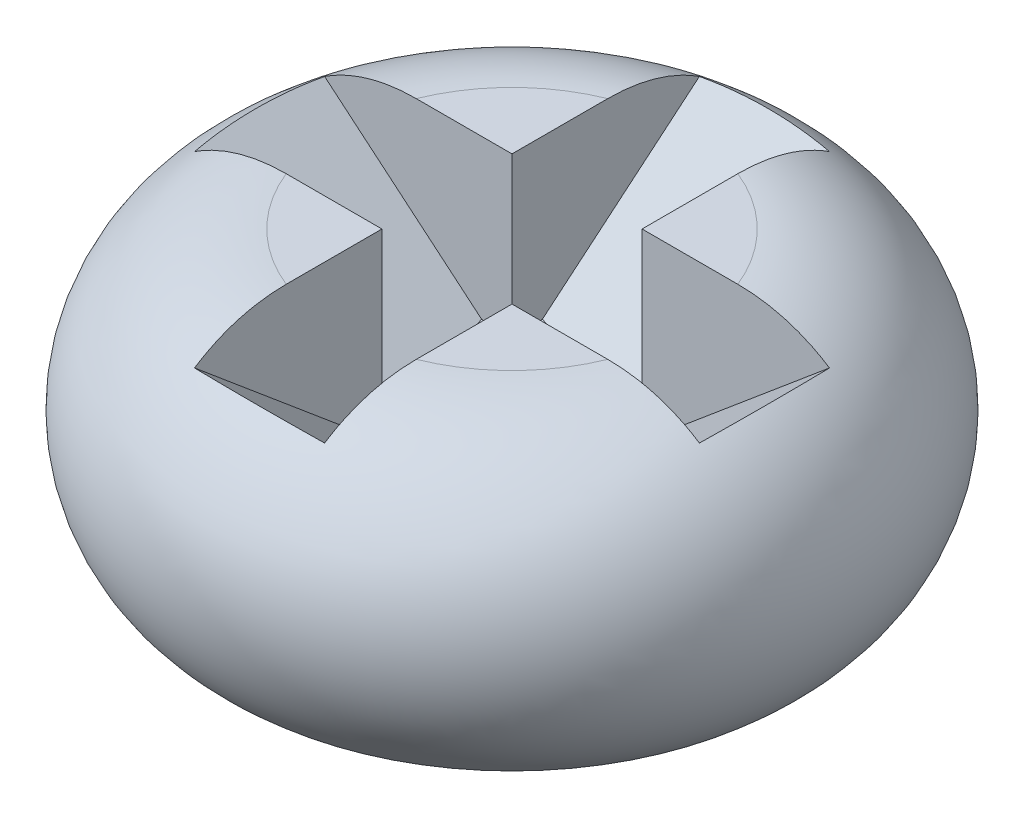
ISO-10303-21;
HEADER;
FILE_DESCRIPTION(('STEP AP214'),'2;1');
FILE_NAME('part.step','',(''),(''),'','','');
FILE_SCHEMA(('AUTOMOTIVE_DESIGN { 1 0 10303 214 1 1 1 1 }'));
ENDSEC;
DATA;
#1=APPLICATION_CONTEXT('core data for automotive mechanical design processes');
#2=APPLICATION_PROTOCOL_DEFINITION('international standard','automotive_design',2000,#1);
#3=PRODUCT_CONTEXT('',#1,'mechanical');
#4=PRODUCT('Part','Part','',(#3));
#5=PRODUCT_RELATED_PRODUCT_CATEGORY('part','',(#4));
#6=PRODUCT_DEFINITION_FORMATION('','',#4);
#7=PRODUCT_DEFINITION_CONTEXT('part definition',#1,'design');
#8=PRODUCT_DEFINITION('design','',#6,#7);
#9=PRODUCT_DEFINITION_SHAPE('','',#8);
#10=(LENGTH_UNIT() NAMED_UNIT(*) SI_UNIT(.MILLI.,.METRE.));
#11=(NAMED_UNIT(*) PLANE_ANGLE_UNIT() SI_UNIT($,.RADIAN.));
#12=(NAMED_UNIT(*) SI_UNIT($,.STERADIAN.) SOLID_ANGLE_UNIT());
#13=UNCERTAINTY_MEASURE_WITH_UNIT(LENGTH_MEASURE(1.E-05),#10,'distance_accuracy_value','');
#14=(GEOMETRIC_REPRESENTATION_CONTEXT(3) GLOBAL_UNCERTAINTY_ASSIGNED_CONTEXT((#13)) GLOBAL_UNIT_ASSIGNED_CONTEXT((#10,
#11,#12)) REPRESENTATION_CONTEXT('',''));
#15=CARTESIAN_POINT('',(0.,0.,0.));
#16=DIRECTION('',(0.,0.,1.));
#17=DIRECTION('',(1.,0.,0.));
#18=AXIS2_PLACEMENT_3D('',#15,#16,#17);
#19=CARTESIAN_POINT('',(0.,12.58,0.));
#20=DIRECTION('',(1.,0.,0.));
#21=DIRECTION('',(0.,-0.976305416822153,0.21639716514715));
#22=AXIS2_PLACEMENT_3D('',#19,#20,#21);
#23=SPHERICAL_SURFACE('',#22,2.08);
#24=CARTESIAN_POINT('',(0.,12.58,-0.3));
#25=DIRECTION('',(0.,0.,1.));
#26=DIRECTION('',(1.,0.,0.));
#27=AXIS2_PLACEMENT_3D('',#24,#25,#26);
#28=CIRCLE('',#27,2.05825168529022);
#29=CARTESIAN_POINT('',(-0.440200950777422,10.5693724554424,-0.3));
#30=VERTEX_POINT('',#29);
#31=CARTESIAN_POINT('',(-0.299999999999943,10.5437288982063,-0.3));
#32=VERTEX_POINT('',#31);
#33=EDGE_CURVE('E190',#30,#32,#28,.T.);
#34=ORIENTED_EDGE('',*,*,#33,.F.);
#35=CARTESIAN_POINT('',(-1.17192122608343,11.1833586685775,0.));
#36=DIRECTION('',(-0.642787609686505,-0.766044443119007,0.));
#37=DIRECTION('',(0.766044443119007,-0.642787609686505,0.));
#38=AXIS2_PLACEMENT_3D('',#35,#36,#37);
#39=CIRCLE('',#38,1.00119610028085);
#40=CARTESIAN_POINT('',(-0.440200950775458,10.5693724554417,0.299999999999931));
#41=VERTEX_POINT('',#40);
#42=EDGE_CURVE('E196',#30,#41,#39,.T.);
#43=ORIENTED_EDGE('',*,*,#42,.T.);
#44=CARTESIAN_POINT('',(0.,12.58,0.3));
#45=DIRECTION('',(0.,0.,1.));
#46=DIRECTION('',(1.,0.,0.));
#47=AXIS2_PLACEMENT_3D('',#44,#45,#46);
#48=CIRCLE('',#47,2.05825168529022);
#49=CARTESIAN_POINT('',(-0.300000000000173,10.5437288982064,0.3));
#50=VERTEX_POINT('',#49);
#51=EDGE_CURVE('E203',#41,#50,#48,.T.);
#52=ORIENTED_EDGE('',*,*,#51,.T.);
#53=CARTESIAN_POINT('',(-0.300000000000312,12.58,0.));
#54=DIRECTION('',(1.,0.,0.));
#55=DIRECTION('',(0.,0.,-1.));
#56=AXIS2_PLACEMENT_3D('',#53,#54,#55);
#57=CIRCLE('',#56,2.05825168529017);
#58=CARTESIAN_POINT('',(-0.300000000000156,10.5693724554424,0.44020095077746));
#59=VERTEX_POINT('',#58);
#60=EDGE_CURVE('E212',#59,#50,#57,.T.);
#61=ORIENTED_EDGE('',*,*,#60,.F.);
#62=CARTESIAN_POINT('',(0.,11.1833586685775,1.17192122608343));
#63=DIRECTION('',(0.,-0.766044443119007,0.642787609686505));
#64=DIRECTION('',(0.,-0.642787609686505,-0.766044443119007));
#65=AXIS2_PLACEMENT_3D('',#62,#63,#64);
#66=CIRCLE('',#65,1.00119610028085);
#67=CARTESIAN_POINT('',(0.300000000000003,10.5693724554417,0.440200950775475));
#68=VERTEX_POINT('',#67);
#69=EDGE_CURVE('E218',#59,#68,#66,.T.);
#70=ORIENTED_EDGE('',*,*,#69,.T.);
#71=CARTESIAN_POINT('',(0.299999999999971,12.58,0.));
#72=DIRECTION('',(1.,0.,0.));
#73=DIRECTION('',(0.,0.,-1.));
#74=AXIS2_PLACEMENT_3D('',#71,#72,#73);
#75=CIRCLE('',#74,2.05825168529022);
#76=CARTESIAN_POINT('',(0.299999999999986,10.5437288982063,0.300000000000104));
#77=VERTEX_POINT('',#76);
#78=EDGE_CURVE('E124',#68,#77,#75,.T.);
#79=ORIENTED_EDGE('',*,*,#78,.T.);
#80=CARTESIAN_POINT('',(0.,12.58,0.3));
#81=DIRECTION('',(0.,0.,1.));
#82=DIRECTION('',(1.,0.,0.));
#83=AXIS2_PLACEMENT_3D('',#80,#81,#82);
#84=CIRCLE('',#83,2.05825168529022);
#85=CARTESIAN_POINT('',(0.440200950779002,10.5693724554425,0.3));
#86=VERTEX_POINT('',#85);
#87=EDGE_CURVE('E21',#77,#86,#84,.T.);
#88=ORIENTED_EDGE('',*,*,#87,.T.);
#89=CARTESIAN_POINT('',(1.17192122608451,11.1833586685763,0.));
#90=DIRECTION('',(0.642787609686505,-0.766044443119007,0.));
#91=DIRECTION('',(0.766044443119007,0.642787609686505,0.));
#92=AXIS2_PLACEMENT_3D('',#89,#90,#91);
#93=CIRCLE('',#92,1.0011961002778);
#94=CARTESIAN_POINT('',(0.440200950778984,10.5693724554425,-0.29999999999993));
#95=VERTEX_POINT('',#94);
#96=EDGE_CURVE('E365',#86,#95,#93,.T.);
#97=ORIENTED_EDGE('',*,*,#96,.T.);
#98=CARTESIAN_POINT('',(0.,12.58,-0.3));
#99=DIRECTION('',(0.,0.,1.));
#100=DIRECTION('',(1.,0.,0.));
#101=AXIS2_PLACEMENT_3D('',#98,#99,#100);
#102=CIRCLE('',#101,2.05825168529022);
#103=CARTESIAN_POINT('',(0.300000000000156,10.5437288982064,-0.3));
#104=VERTEX_POINT('',#103);
#105=EDGE_CURVE('E160',#104,#95,#102,.T.);
#106=ORIENTED_EDGE('',*,*,#105,.F.);
#107=CARTESIAN_POINT('',(0.300000000000312,12.58,0.));
#108=DIRECTION('',(1.,0.,0.));
#109=DIRECTION('',(0.,0.,-1.));
#110=AXIS2_PLACEMENT_3D('',#107,#108,#109);
#111=CIRCLE('',#110,2.05825168529017);
#112=CARTESIAN_POINT('',(0.300000000000156,10.5693724554428,-0.440200950779634));
#113=VERTEX_POINT('',#112);
#114=EDGE_CURVE('E156',#104,#113,#111,.T.);
#115=ORIENTED_EDGE('',*,*,#114,.T.);
#116=CARTESIAN_POINT('',(0.,11.1833586685763,-1.17192122608451));
#117=DIRECTION('',(0.,-0.766044443119007,-0.642787609686505));
#118=DIRECTION('',(0.,0.642787609686505,-0.766044443119007));
#119=AXIS2_PLACEMENT_3D('',#116,#117,#118);
#120=CIRCLE('',#119,1.0011961002778);
#121=CARTESIAN_POINT('',(-0.29999999999996,10.5693724554425,-0.440200950778992));
#122=VERTEX_POINT('',#121);
#123=EDGE_CURVE('E176',#113,#122,#120,.T.);
#124=ORIENTED_EDGE('',*,*,#123,.T.);
#125=CARTESIAN_POINT('',(-0.299999999999887,12.58,0.));
#126=DIRECTION('',(1.,0.,0.));
#127=DIRECTION('',(0.,0.,-1.));
#128=AXIS2_PLACEMENT_3D('',#125,#126,#127);
#129=CIRCLE('',#128,2.05825168529023);
#130=EDGE_CURVE('E177',#32,#122,#129,.T.);
#131=ORIENTED_EDGE('',*,*,#130,.F.);
#132=EDGE_LOOP('',(#34,#43,#52,#61,#70,#79,#88,#97,#106,#115,#124,#131));
#133=FACE_BOUND('',#132,.T.);
#134=ADVANCED_FACE('F17',(#133),#23,.F.);
#135=CARTESIAN_POINT('',(0.,0.,0.3));
#136=DIRECTION('',(0.,0.,1.));
#137=DIRECTION('',(1.,0.,0.));
#138=AXIS2_PLACEMENT_3D('',#135,#136,#137);
#139=PLANE('',#138);
#140=DIRECTION('',(0.,1.,0.));
#141=VECTOR('',#140,1.);
#142=CARTESIAN_POINT('',(0.3,0.,0.300000000000208));
#143=LINE('',#142,#141);
#144=CARTESIAN_POINT('',(0.3,11.3,0.300000000000138));
#145=VERTEX_POINT('',#144);
#146=EDGE_CURVE('E221',#77,#145,#143,.T.);
#147=ORIENTED_EDGE('',*,*,#146,.T.);
#148=DIRECTION('',(1.,0.,0.));
#149=VECTOR('',#148,1.);
#150=CARTESIAN_POINT('',(0.,11.3,0.3));
#151=LINE('',#150,#149);
#152=CARTESIAN_POINT('',(0.7416198487096,11.3,0.3));
#153=VERTEX_POINT('',#152);
#154=EDGE_CURVE('E129',#145,#153,#151,.T.);
#155=ORIENTED_EDGE('',*,*,#154,.T.);
#156=CARTESIAN_POINT('',(1.16439313723827,11.1770418520021,0.3));
#157=CARTESIAN_POINT('',(1.1462920134691,11.1888566460189,0.3));
#158=CARTESIAN_POINT('',(1.12767999500602,11.1998641315015,0.3));
#159=CARTESIAN_POINT('',(1.0895699049842,11.2202130903488,0.3));
#160=CARTESIAN_POINT('',(1.07007197222012,11.2295548235622,0.3));
#161=CARTESIAN_POINT('',(1.01140722725074,11.2545983398488,0.3));
#162=CARTESIAN_POINT('',(0.971178721521328,11.2678936614015,0.3));
#163=CARTESIAN_POINT('',(0.899606875693785,11.285209987668,0.3));
#164=CARTESIAN_POINT('',(0.868608459641808,11.2907302919065,0.3));
#165=CARTESIAN_POINT('',(0.805618984449627,11.298164607655,0.3));
#166=CARTESIAN_POINT('',(0.773620079624039,11.3000126158581,0.3));
#167=CARTESIAN_POINT('',(0.741619848709601,11.3,0.3));
#168=B_SPLINE_CURVE_WITH_KNOTS('',3,(#156,#157,#158,#159,#160,#161,#162,#163,#164,#165,#166,
#167),.UNSPECIFIED.,.F.,.F.,(4,2,2,2,2,4),(0.,0.0648004256213969,0.12959073384333,
0.256031799616268,0.350287197571921,0.446221884315936),.UNSPECIFIED.);
#169=CARTESIAN_POINT('',(1.16439313723804,11.1770418520018,0.3));
#170=VERTEX_POINT('',#169);
#171=EDGE_CURVE('E358',#170,#153,#168,.T.);
#172=ORIENTED_EDGE('',*,*,#171,.F.);
#173=DIRECTION('',(0.766044443119007,0.642787609686505,0.));
#174=VECTOR('',#173,1.);
#175=CARTESIAN_POINT('',(0.,10.2,0.3));
#176=LINE('',#175,#174);
#177=EDGE_CURVE('E393',#170,#86,#176,.F.);
#178=ORIENTED_EDGE('',*,*,#177,.T.);
#179=ORIENTED_EDGE('',*,*,#87,.F.);
#180=EDGE_LOOP('',(#147,#155,#172,#178,#179));
#181=FACE_BOUND('',#180,.T.);
#182=ADVANCED_FACE('F367',(#181),#139,.F.);
#183=CARTESIAN_POINT('',(0.,11.3,0.));
#184=DIRECTION('',(0.,-1.,0.));
#185=DIRECTION('',(0.,0.,-1.));
#186=AXIS2_PLACEMENT_3D('',#183,#184,#185);
#187=PLANE('',#186);
#188=ORIENTED_EDGE('',*,*,#154,.F.);
#189=DIRECTION('',(0.,0.,-1.));
#190=VECTOR('',#189,1.);
#191=CARTESIAN_POINT('',(0.3,11.3,0.));
#192=LINE('',#191,#190);
#193=CARTESIAN_POINT('',(0.3,11.3,0.7416198487096));
#194=VERTEX_POINT('',#193);
#195=EDGE_CURVE('E225',#145,#194,#192,.F.);
#196=ORIENTED_EDGE('',*,*,#195,.T.);
#197=CARTESIAN_POINT('',(0.,11.3,0.));
#198=DIRECTION('',(0.,-1.,0.));
#199=DIRECTION('',(0.,0.,-1.));
#200=AXIS2_PLACEMENT_3D('',#197,#198,#199);
#201=CIRCLE('',#200,0.800000000000031);
#202=EDGE_CURVE('E355',#153,#194,#201,.T.);
#203=ORIENTED_EDGE('',*,*,#202,.F.);
#204=EDGE_LOOP('',(#188,#196,#203));
#205=FACE_BOUND('',#204,.T.);
#206=ADVANCED_FACE('F346',(#205),#187,.F.);
#207=CARTESIAN_POINT('',(0.3,0.,0.));
#208=DIRECTION('',(1.,0.,0.));
#209=DIRECTION('',(0.,0.,-1.));
#210=AXIS2_PLACEMENT_3D('',#207,#208,#209);
#211=PLANE('',#210);
#212=ORIENTED_EDGE('',*,*,#78,.F.);
#213=DIRECTION('',(0.,-0.642787609686505,-0.766044443119007));
#214=VECTOR('',#213,1.);
#215=CARTESIAN_POINT('',(0.300000000000034,11.7589743755,1.857913312762));
#216=LINE('',#215,#214);
#217=CARTESIAN_POINT('',(0.300000000000108,11.1770418520028,1.1643931372367));
#218=VERTEX_POINT('',#217);
#219=EDGE_CURVE('E219',#68,#218,#216,.F.);
#220=ORIENTED_EDGE('',*,*,#219,.T.);
#221=CARTESIAN_POINT('',(0.3,11.3,0.7416198487096));
#222=CARTESIAN_POINT('',(0.3,11.3000008783448,0.764401166352597));
#223=CARTESIAN_POINT('',(0.3,11.2990695605374,0.787173130496207));
#224=CARTESIAN_POINT('',(0.3,11.2952923100565,0.832572301311435));
#225=CARTESIAN_POINT('',(0.3,11.292445088101,0.855199400140092));
#226=CARTESIAN_POINT('',(0.3,11.2811561773008,0.921452851003217));
#227=CARTESIAN_POINT('',(0.3,11.2699697984938,0.964657533608746));
#228=CARTESIAN_POINT('',(0.3,11.2453334227092,1.03401981263815));
#229=CARTESIAN_POINT('',(0.3,11.2339744673469,1.06094340308212));
#230=CARTESIAN_POINT('',(0.3,11.2079692293399,1.11371500492958));
#231=CARTESIAN_POINT('',(0.3,11.1932710189738,1.13953741132456));
#232=CARTESIAN_POINT('',(0.3,11.177041852003,1.16439313723679));
#233=B_SPLINE_CURVE_WITH_KNOTS('',3,(#221,#222,#223,#224,#225,#226,#227,#228,#229,#230,#231,
#232),.UNSPECIFIED.,.F.,.F.,(4,2,2,2,2,4),(0.,0.0683033981461132,0.136652806179978,
0.269778402475849,0.357261289443658,0.446211076445226),.UNSPECIFIED.);
#234=EDGE_CURVE('E349',#194,#218,#233,.T.);
#235=ORIENTED_EDGE('',*,*,#234,.F.);
#236=ORIENTED_EDGE('',*,*,#195,.F.);
#237=ORIENTED_EDGE('',*,*,#146,.F.);
#238=EDGE_LOOP('',(#212,#220,#235,#236,#237));
#239=FACE_BOUND('',#238,.T.);
#240=ADVANCED_FACE('F341',(#239),#211,.F.);
#241=CARTESIAN_POINT('',(0.3,11.7589743755,1.857913312762));
#242=DIRECTION('',(0.,-0.766044443119007,0.642787609686505));
#243=DIRECTION('',(0.,-0.642787609686505,-0.766044443119007));
#244=AXIS2_PLACEMENT_3D('',#241,#242,#243);
#245=PLANE('',#244);
#246=DIRECTION('',(0.,-0.642787609686157,-0.766044443119299));
#247=VECTOR('',#246,1.);
#248=CARTESIAN_POINT('',(-0.3,11.1770418520009,1.16439313723828));
#249=LINE('',#248,#247);
#250=CARTESIAN_POINT('',(-0.3,11.1770418520015,1.16439313723834));
#251=VERTEX_POINT('',#250);
#252=EDGE_CURVE('E215',#251,#59,#249,.T.);
#253=ORIENTED_EDGE('',*,*,#252,.F.);
#254=CARTESIAN_POINT('',(0.300000000000139,11.1770418520029,1.16439313723691));
#255=CARTESIAN_POINT('',(0.25022176130477,11.1817360196843,1.16998742843538));
#256=CARTESIAN_POINT('',(0.200179582896445,11.1852193124558,1.17413865510988));
#257=CARTESIAN_POINT('',(0.10009070029791,11.1898210287083,1.17962276698593));
#258=CARTESIAN_POINT('',(0.050045350148981,11.1909515545019,1.1809700751619));
#259=CARTESIAN_POINT('',(-0.0500453501488767,11.1909515545019,1.1809700751619));
#260=CARTESIAN_POINT('',(-0.100090700297805,11.1898210287083,1.17962276698593));
#261=CARTESIAN_POINT('',(-0.200179582896341,11.1852193124558,1.17413865510988));
#262=CARTESIAN_POINT('',(-0.250221761304666,11.1817360196843,1.16998742843539));
#263=CARTESIAN_POINT('',(-0.300000000000036,11.177041852003,1.16439313723692));
#264=B_SPLINE_CURVE_WITH_KNOTS('',3,(#254,#255,#256,#257,#258,#259,#260,#261,#262,#263),
.UNSPECIFIED.,.F.,.F.,(4,2,2,2,4),(0.,0.15087844021484,0.300978844462054,0.451079248709267,
0.601957688924107),.UNSPECIFIED.);
#265=EDGE_CURVE('E327',#218,#251,#264,.T.);
#266=ORIENTED_EDGE('',*,*,#265,.F.);
#267=ORIENTED_EDGE('',*,*,#219,.F.);
#268=ORIENTED_EDGE('',*,*,#69,.F.);
#269=EDGE_LOOP('',(#253,#266,#267,#268));
#270=FACE_BOUND('',#269,.T.);
#271=ADVANCED_FACE('F336',(#270),#245,.F.);
#272=CARTESIAN_POINT('',(-0.3,0.,0.));
#273=DIRECTION('',(1.,0.,0.));
#274=DIRECTION('',(0.,0.,-1.));
#275=AXIS2_PLACEMENT_3D('',#272,#273,#274);
#276=PLANE('',#275);
#277=ORIENTED_EDGE('',*,*,#60,.T.);
#278=DIRECTION('',(0.,1.,0.));
#279=VECTOR('',#278,1.);
#280=CARTESIAN_POINT('',(-0.300000000000034,0.,0.3));
#281=LINE('',#280,#279);
#282=CARTESIAN_POINT('',(-0.300000000000023,11.3,0.3));
#283=VERTEX_POINT('',#282);
#284=EDGE_CURVE('E200',#50,#283,#281,.T.);
#285=ORIENTED_EDGE('',*,*,#284,.T.);
#286=DIRECTION('',(0.,0.,-1.));
#287=VECTOR('',#286,1.);
#288=CARTESIAN_POINT('',(-0.3,11.3,0.));
#289=LINE('',#288,#287);
#290=CARTESIAN_POINT('',(-0.3,11.3,0.7416198487096));
#291=VERTEX_POINT('',#290);
#292=EDGE_CURVE('E208',#283,#291,#289,.F.);
#293=ORIENTED_EDGE('',*,*,#292,.T.);
#294=CARTESIAN_POINT('',(-0.3,11.177041852002,1.16439313723841));
#295=CARTESIAN_POINT('',(-0.3,11.1888566460188,1.14629201346923));
#296=CARTESIAN_POINT('',(-0.3,11.1998641315015,1.12767999500616));
#297=CARTESIAN_POINT('',(-0.3,11.2202130903487,1.08956990498435));
#298=CARTESIAN_POINT('',(-0.3,11.2295548235622,1.07007197222027));
#299=CARTESIAN_POINT('',(-0.3,11.2545983398487,1.0114072272509));
#300=CARTESIAN_POINT('',(-0.3,11.2678936614014,0.971178721521491));
#301=CARTESIAN_POINT('',(-0.3,11.285209987668,0.899606875693925));
#302=CARTESIAN_POINT('',(-0.3,11.2907302919065,0.868608459641921));
#303=CARTESIAN_POINT('',(-0.3,11.298164607655,0.805618984449684));
#304=CARTESIAN_POINT('',(-0.3,11.3000126158581,0.773620079624067));
#305=CARTESIAN_POINT('',(-0.3,11.3,0.7416198487096));
#306=B_SPLINE_CURVE_WITH_KNOTS('',3,(#294,#295,#296,#297,#298,#299,#300,#301,#302,#303,#304,
#305),.UNSPECIFIED.,.F.,.F.,(4,2,2,2,2,4),(0.,0.0648004256213951,0.129590733843327,
0.256031799616261,0.350287197571998,0.4462218843161),.UNSPECIFIED.);
#307=EDGE_CURVE('E321',#251,#291,#306,.T.);
#308=ORIENTED_EDGE('',*,*,#307,.F.);
#309=ORIENTED_EDGE('',*,*,#252,.T.);
#310=EDGE_LOOP('',(#277,#285,#293,#308,#309));
#311=FACE_BOUND('',#310,.T.);
#312=ADVANCED_FACE('F333',(#311),#276,.T.);
#313=CARTESIAN_POINT('',(0.,11.3,0.));
#314=DIRECTION('',(0.,-1.,0.));
#315=DIRECTION('',(0.,0.,-1.));
#316=AXIS2_PLACEMENT_3D('',#313,#314,#315);
#317=PLANE('',#316);
#318=DIRECTION('',(1.,0.,0.));
#319=VECTOR('',#318,1.);
#320=CARTESIAN_POINT('',(0.,11.3,0.3));
#321=LINE('',#320,#319);
#322=CARTESIAN_POINT('',(-0.7416198487096,11.3,0.3));
#323=VERTEX_POINT('',#322);
#324=EDGE_CURVE('E206',#283,#323,#321,.F.);
#325=ORIENTED_EDGE('',*,*,#324,.T.);
#326=CARTESIAN_POINT('',(0.,11.3,0.));
#327=DIRECTION('',(0.,-1.,0.));
#328=DIRECTION('',(0.,0.,-1.));
#329=AXIS2_PLACEMENT_3D('',#326,#327,#328);
#330=CIRCLE('',#329,0.80000000000003);
#331=EDGE_CURVE('E318',#291,#323,#330,.T.);
#332=ORIENTED_EDGE('',*,*,#331,.F.);
#333=ORIENTED_EDGE('',*,*,#292,.F.);
#334=EDGE_LOOP('',(#325,#332,#333));
#335=FACE_BOUND('',#334,.T.);
#336=ADVANCED_FACE('F309',(#335),#317,.F.);
#337=CARTESIAN_POINT('',(0.,0.,0.3));
#338=DIRECTION('',(0.,0.,1.));
#339=DIRECTION('',(1.,0.,0.));
#340=AXIS2_PLACEMENT_3D('',#337,#338,#339);
#341=PLANE('',#340);
#342=ORIENTED_EDGE('',*,*,#51,.F.);
#343=DIRECTION('',(0.766044443119007,-0.642787609686505,0.));
#344=VECTOR('',#343,1.);
#345=CARTESIAN_POINT('',(-1.857913312762,11.7589743755,0.299999999999862));
#346=LINE('',#345,#344);
#347=CARTESIAN_POINT('',(-1.1643931372367,11.1770418520028,0.300000000000108));
#348=VERTEX_POINT('',#347);
#349=EDGE_CURVE('E197',#41,#348,#346,.F.);
#350=ORIENTED_EDGE('',*,*,#349,.T.);
#351=CARTESIAN_POINT('',(-0.7416198487096,11.3,0.3));
#352=CARTESIAN_POINT('',(-0.764401166352598,11.3000008783449,0.3));
#353=CARTESIAN_POINT('',(-0.787173130496208,11.2990695605374,0.3));
#354=CARTESIAN_POINT('',(-0.832572301311435,11.2952923100565,0.3));
#355=CARTESIAN_POINT('',(-0.855199400140092,11.292445088101,0.3));
#356=CARTESIAN_POINT('',(-0.921452851003217,11.2811561773008,0.3));
#357=CARTESIAN_POINT('',(-0.964657533608746,11.2699697984938,0.3));
#358=CARTESIAN_POINT('',(-1.03401981263815,11.2453334227092,0.3));
#359=CARTESIAN_POINT('',(-1.06094340308212,11.2339744673469,0.3));
#360=CARTESIAN_POINT('',(-1.11371500492958,11.2079692293399,0.3));
#361=CARTESIAN_POINT('',(-1.13953741132456,11.1932710189738,0.3));
#362=CARTESIAN_POINT('',(-1.16439313723679,11.177041852003,0.3));
#363=B_SPLINE_CURVE_WITH_KNOTS('',3,(#351,#352,#353,#354,#355,#356,#357,#358,#359,#360,#361,
#362),.UNSPECIFIED.,.F.,.F.,(4,2,2,2,2,4),(0.,0.0683033981461132,0.136652806179978,
0.269778402475849,0.357261289443659,0.446211076445227),.UNSPECIFIED.);
#364=EDGE_CURVE('E312',#323,#348,#363,.T.);
#365=ORIENTED_EDGE('',*,*,#364,.F.);
#366=ORIENTED_EDGE('',*,*,#324,.F.);
#367=ORIENTED_EDGE('',*,*,#284,.F.);
#368=EDGE_LOOP('',(#342,#350,#365,#366,#367));
#369=FACE_BOUND('',#368,.T.);
#370=ADVANCED_FACE('F304',(#369),#341,.F.);
#371=CARTESIAN_POINT('',(-1.857913312762,11.7589743755,0.3));
#372=DIRECTION('',(-0.642787609686505,-0.766044443119007,0.));
#373=DIRECTION('',(0.766044443119007,-0.642787609686505,0.));
#374=AXIS2_PLACEMENT_3D('',#371,#372,#373);
#375=PLANE('',#374);
#376=ORIENTED_EDGE('',*,*,#42,.F.);
#377=DIRECTION('',(0.766044443119299,-0.642787609686157,0.));
#378=VECTOR('',#377,1.);
#379=CARTESIAN_POINT('',(-1.16439313723828,11.1770418520009,-0.3));
#380=LINE('',#379,#378);
#381=CARTESIAN_POINT('',(-1.16439313723834,11.1770418520015,-0.3));
#382=VERTEX_POINT('',#381);
#383=EDGE_CURVE('E193',#382,#30,#380,.T.);
#384=ORIENTED_EDGE('',*,*,#383,.F.);
#385=CARTESIAN_POINT('',(-1.16439313723691,11.1770418520029,0.300000000000139));
#386=CARTESIAN_POINT('',(-1.16998742847924,11.1817360197211,0.250221761307122));
#387=CARTESIAN_POINT('',(-1.1741386551371,11.1852193124786,0.20017958290014));
#388=CARTESIAN_POINT('',(-1.17962276695847,11.1898210286853,0.100090700301254));
#389=CARTESIAN_POINT('',(-1.18097007509638,11.1909515544469,0.0500453501506272));
#390=CARTESIAN_POINT('',(-1.18097007509638,11.1909515544469,-0.0500453501506098));
#391=CARTESIAN_POINT('',(-1.17962276695847,11.1898210286853,-0.10009070030122));
#392=CARTESIAN_POINT('',(-1.1741386551371,11.1852193124786,-0.20017958290007));
#393=CARTESIAN_POINT('',(-1.16998742847924,11.1817360197211,-0.250221761307036));
#394=CARTESIAN_POINT('',(-1.16439313723692,11.177041852003,-0.300000000000036));
#395=B_SPLINE_CURVE_WITH_KNOTS('',3,(#385,#386,#387,#388,#389,#390,#391,#392,#393,#394),
.UNSPECIFIED.,.F.,.F.,(4,2,2,2,4),(0.,0.150878440210301,0.30097884445907,0.451079248707787,
0.601957688918035),.UNSPECIFIED.);
#396=EDGE_CURVE('E288',#348,#382,#395,.T.);
#397=ORIENTED_EDGE('',*,*,#396,.F.);
#398=ORIENTED_EDGE('',*,*,#349,.F.);
#399=EDGE_LOOP('',(#376,#384,#397,#398));
#400=FACE_BOUND('',#399,.T.);
#401=ADVANCED_FACE('F299',(#400),#375,.F.);
#402=CARTESIAN_POINT('',(0.,0.,-0.3));
#403=DIRECTION('',(0.,0.,1.));
#404=DIRECTION('',(1.,0.,0.));
#405=AXIS2_PLACEMENT_3D('',#402,#403,#404);
#406=PLANE('',#405);
#407=ORIENTED_EDGE('',*,*,#383,.T.);
#408=ORIENTED_EDGE('',*,*,#33,.T.);
#409=DIRECTION('',(0.,1.,0.));
#410=VECTOR('',#409,1.);
#411=CARTESIAN_POINT('',(-0.3,0.,-0.3));
#412=LINE('',#411,#410);
#413=CARTESIAN_POINT('',(-0.3,11.3,-0.3));
#414=VERTEX_POINT('',#413);
#415=EDGE_CURVE('E178',#414,#32,#412,.F.);
#416=ORIENTED_EDGE('',*,*,#415,.F.);
#417=DIRECTION('',(1.,0.,0.));
#418=VECTOR('',#417,1.);
#419=CARTESIAN_POINT('',(0.,11.3,-0.3));
#420=LINE('',#419,#418);
#421=CARTESIAN_POINT('',(-0.7416198487096,11.3,-0.3));
#422=VERTEX_POINT('',#421);
#423=EDGE_CURVE('E186',#414,#422,#420,.F.);
#424=ORIENTED_EDGE('',*,*,#423,.T.);
#425=CARTESIAN_POINT('',(-1.16439313723841,11.177041852002,-0.3));
#426=CARTESIAN_POINT('',(-1.14629201346924,11.1888566460188,-0.3));
#427=CARTESIAN_POINT('',(-1.12767999500617,11.1998641315015,-0.3));
#428=CARTESIAN_POINT('',(-1.08956990498435,11.2202130903487,-0.3));
#429=CARTESIAN_POINT('',(-1.07007197222027,11.2295548235622,-0.3));
#430=CARTESIAN_POINT('',(-1.0114072272509,11.2545983398487,-0.3));
#431=CARTESIAN_POINT('',(-0.971178721521491,11.2678936614014,-0.3));
#432=CARTESIAN_POINT('',(-0.899606875693926,11.285209987668,-0.3));
#433=CARTESIAN_POINT('',(-0.868608459641922,11.2907302919065,-0.3));
#434=CARTESIAN_POINT('',(-0.805618984449685,11.298164607655,-0.3));
#435=CARTESIAN_POINT('',(-0.773620079624068,11.3000126158581,-0.3));
#436=CARTESIAN_POINT('',(-0.741619848709601,11.3,-0.3));
#437=B_SPLINE_CURVE_WITH_KNOTS('',3,(#425,#426,#427,#428,#429,#430,#431,#432,#433,#434,#435,
#436),.UNSPECIFIED.,.F.,.F.,(4,2,2,2,2,4),(0.,0.0648004256213956,0.129590733843327,
0.256031799616261,0.350287197571998,0.4462218843161),.UNSPECIFIED.);
#438=EDGE_CURVE('E281',#382,#422,#437,.T.);
#439=ORIENTED_EDGE('',*,*,#438,.F.);
#440=EDGE_LOOP('',(#407,#408,#416,#424,#439));
#441=FACE_BOUND('',#440,.T.);
#442=ADVANCED_FACE('F294',(#441),#406,.T.);
#443=CARTESIAN_POINT('',(0.,11.3,0.));
#444=DIRECTION('',(0.,-1.,0.));
#445=DIRECTION('',(0.,0.,-1.));
#446=AXIS2_PLACEMENT_3D('',#443,#444,#445);
#447=PLANE('',#446);
#448=ORIENTED_EDGE('',*,*,#423,.F.);
#449=DIRECTION('',(0.,0.,-1.));
#450=VECTOR('',#449,1.);
#451=CARTESIAN_POINT('',(-0.3,11.3,0.));
#452=LINE('',#451,#450);
#453=CARTESIAN_POINT('',(-0.3,11.3,-0.7416198487096));
#454=VERTEX_POINT('',#453);
#455=EDGE_CURVE('E181',#454,#414,#452,.F.);
#456=ORIENTED_EDGE('',*,*,#455,.F.);
#457=CARTESIAN_POINT('',(0.,11.3,0.));
#458=DIRECTION('',(0.,-1.,0.));
#459=DIRECTION('',(0.,0.,-1.));
#460=AXIS2_PLACEMENT_3D('',#457,#458,#459);
#461=CIRCLE('',#460,0.800000000000031);
#462=EDGE_CURVE('E287',#422,#454,#461,.T.);
#463=ORIENTED_EDGE('',*,*,#462,.F.);
#464=EDGE_LOOP('',(#448,#456,#463));
#465=FACE_BOUND('',#464,.T.);
#466=ADVANCED_FACE('F298',(#465),#447,.F.);
#467=CARTESIAN_POINT('',(-0.3,0.,0.));
#468=DIRECTION('',(1.,0.,0.));
#469=DIRECTION('',(0.,0.,-1.));
#470=AXIS2_PLACEMENT_3D('',#467,#468,#469);
#471=PLANE('',#470);
#472=ORIENTED_EDGE('',*,*,#130,.T.);
#473=DIRECTION('',(0.,0.642787609686505,-0.766044443119007));
#474=VECTOR('',#473,1.);
#475=CARTESIAN_POINT('',(-0.300000000000034,10.2,0.));
#476=LINE('',#475,#474);
#477=CARTESIAN_POINT('',(-0.30000000000016,11.1770418520017,-1.16439313723807));
#478=VERTEX_POINT('',#477);
#479=EDGE_CURVE('E174',#122,#478,#476,.T.);
#480=ORIENTED_EDGE('',*,*,#479,.T.);
#481=CARTESIAN_POINT('',(-0.3,11.3,-0.7416198487096));
#482=CARTESIAN_POINT('',(-0.3,11.3000008783449,-0.764401166352599));
#483=CARTESIAN_POINT('',(-0.3,11.2990695605374,-0.78717313049621));
#484=CARTESIAN_POINT('',(-0.3,11.2952923100565,-0.83257230131144));
#485=CARTESIAN_POINT('',(-0.3,11.292445088101,-0.855199400140097));
#486=CARTESIAN_POINT('',(-0.3,11.2811561773008,-0.921452851003222));
#487=CARTESIAN_POINT('',(-0.3,11.2699697984938,-0.964657533608748));
#488=CARTESIAN_POINT('',(-0.3,11.2453334227091,-1.0340198126384));
#489=CARTESIAN_POINT('',(-0.3,11.2339744673467,-1.06094340308263));
#490=CARTESIAN_POINT('',(-0.3,11.2079692293394,-1.11371500493056));
#491=CARTESIAN_POINT('',(-0.3,11.1932710189731,-1.13953741132576));
#492=CARTESIAN_POINT('',(-0.3,11.1770418520021,-1.16439313723819));
#493=B_SPLINE_CURVE_WITH_KNOTS('',3,(#481,#482,#483,#484,#485,#486,#487,#488,#489,#490,#491,
#492),.UNSPECIFIED.,.F.,.F.,(4,2,2,2,2,4),(0.,0.0683033981461166,0.136652806179985,
0.269778402475849,0.357261289444479,0.446211076446901),.UNSPECIFIED.);
#494=EDGE_CURVE('E274',#454,#478,#493,.T.);
#495=ORIENTED_EDGE('',*,*,#494,.F.);
#496=ORIENTED_EDGE('',*,*,#455,.T.);
#497=ORIENTED_EDGE('',*,*,#415,.T.);
#498=EDGE_LOOP('',(#472,#480,#495,#496,#497));
#499=FACE_BOUND('',#498,.T.);
#500=ADVANCED_FACE('F430',(#499),#471,.T.);
#501=CARTESIAN_POINT('',(0.3,10.2,0.));
#502=DIRECTION('',(0.,-0.766044443119007,-0.642787609686505));
#503=DIRECTION('',(0.,0.642787609686505,-0.766044443119007));
#504=AXIS2_PLACEMENT_3D('',#501,#502,#503);
#505=PLANE('',#504);
#506=DIRECTION('',(0.,0.642787609686305,-0.766044443119175));
#507=VECTOR('',#506,1.);
#508=CARTESIAN_POINT('',(0.3,10.5693724554412,-0.440200950778457));
#509=LINE('',#508,#507);
#510=CARTESIAN_POINT('',(0.3,11.1770418520013,-1.1643931372386));
#511=VERTEX_POINT('',#510);
#512=EDGE_CURVE('E150',#113,#511,#509,.T.);
#513=ORIENTED_EDGE('',*,*,#512,.T.);
#514=CARTESIAN_POINT('',(-0.300000000000206,11.177041852002,-1.16439313723836));
#515=CARTESIAN_POINT('',(-0.250221761304826,11.1817360196833,-1.16998742843685));
#516=CARTESIAN_POINT('',(-0.200179582896489,11.1852193124548,-1.17413865511136));
#517=CARTESIAN_POINT('',(-0.100090700297932,11.1898210287074,-1.17962276698742));
#518=CARTESIAN_POINT('',(-0.050045350148992,11.1909515545009,-1.1809700751634));
#519=CARTESIAN_POINT('',(0.0500453501488883,11.1909515545009,-1.1809700751634));
#520=CARTESIAN_POINT('',(0.100090700297828,11.1898210287074,-1.17962276698743));
#521=CARTESIAN_POINT('',(0.200179582896386,11.1852193124548,-1.17413865511137));
#522=CARTESIAN_POINT('',(0.250221761304723,11.1817360196833,-1.16998742843686));
#523=CARTESIAN_POINT('',(0.300000000000103,11.177041852002,-1.16439313723838));
#524=B_SPLINE_CURVE_WITH_KNOTS('',3,(#514,#515,#516,#517,#518,#519,#520,#521,#522,#523),
.UNSPECIFIED.,.F.,.F.,(4,2,2,2,4),(0.,0.150878440214877,0.300978844462124,0.451079248709371,
0.601957688924249),.UNSPECIFIED.);
#525=EDGE_CURVE('E268',#478,#511,#524,.T.);
#526=ORIENTED_EDGE('',*,*,#525,.F.);
#527=ORIENTED_EDGE('',*,*,#479,.F.);
#528=ORIENTED_EDGE('',*,*,#123,.F.);
#529=EDGE_LOOP('',(#513,#526,#527,#528));
#530=FACE_BOUND('',#529,.T.);
#531=ADVANCED_FACE('F435',(#530),#505,.F.);
#532=CARTESIAN_POINT('',(0.3,0.,0.));
#533=DIRECTION('',(1.,0.,0.));
#534=DIRECTION('',(0.,0.,-1.));
#535=AXIS2_PLACEMENT_3D('',#532,#533,#534);
#536=PLANE('',#535);
#537=ORIENTED_EDGE('',*,*,#114,.F.);
#538=DIRECTION('',(0.,1.,0.));
#539=VECTOR('',#538,1.);
#540=CARTESIAN_POINT('',(0.3,0.,-0.3));
#541=LINE('',#540,#539);
#542=CARTESIAN_POINT('',(0.3,11.3,-0.3));
#543=VERTEX_POINT('',#542);
#544=EDGE_CURVE('E153',#543,#104,#541,.F.);
#545=ORIENTED_EDGE('',*,*,#544,.F.);
#546=DIRECTION('',(0.,0.,-1.));
#547=VECTOR('',#546,1.);
#548=CARTESIAN_POINT('',(0.3,11.3,0.));
#549=LINE('',#548,#547);
#550=CARTESIAN_POINT('',(0.3,11.3,-0.7416198487096));
#551=VERTEX_POINT('',#550);
#552=EDGE_CURVE('E139',#543,#551,#549,.T.);
#553=ORIENTED_EDGE('',*,*,#552,.T.);
#554=CARTESIAN_POINT('',(0.3,11.1770418520017,-1.16439313723879));
#555=CARTESIAN_POINT('',(0.3,11.1888566460185,-1.14629201346962));
#556=CARTESIAN_POINT('',(0.3,11.1998641315012,-1.12767999500656));
#557=CARTESIAN_POINT('',(0.3,11.2202130903485,-1.08956990498476));
#558=CARTESIAN_POINT('',(0.3,11.229554823562,-1.07007197222069));
#559=CARTESIAN_POINT('',(0.3,11.2545983398486,-1.01140722725134));
#560=CARTESIAN_POINT('',(0.3,11.2678936614013,-0.971178721521943));
#561=CARTESIAN_POINT('',(0.3,11.2852099876679,-0.899606875694317));
#562=CARTESIAN_POINT('',(0.3,11.2907302919064,-0.868608459642238));
#563=CARTESIAN_POINT('',(0.3,11.298164607655,-0.805618984449846));
#564=CARTESIAN_POINT('',(0.3,11.3000126158581,-0.773620079624148));
#565=CARTESIAN_POINT('',(0.3,11.3,-0.7416198487096));
#566=B_SPLINE_CURVE_WITH_KNOTS('',3,(#554,#555,#556,#557,#558,#559,#560,#561,#562,#563,#564,
#565),.UNSPECIFIED.,.F.,.F.,(4,2,2,2,2,4),(0.,0.0648004256213908,0.129590733843318,
0.256031799616239,0.350287197572208,0.446221884316552),.UNSPECIFIED.);
#567=EDGE_CURVE('E261',#511,#551,#566,.T.);
#568=ORIENTED_EDGE('',*,*,#567,.F.);
#569=ORIENTED_EDGE('',*,*,#512,.F.);
#570=EDGE_LOOP('',(#537,#545,#553,#568,#569));
#571=FACE_BOUND('',#570,.T.);
#572=ADVANCED_FACE('F154',(#571),#536,.F.);
#573=CARTESIAN_POINT('',(0.,11.3,0.));
#574=DIRECTION('',(0.,-1.,0.));
#575=DIRECTION('',(0.,0.,-1.));
#576=AXIS2_PLACEMENT_3D('',#573,#574,#575);
#577=PLANE('',#576);
#578=DIRECTION('',(1.,0.,0.));
#579=VECTOR('',#578,1.);
#580=CARTESIAN_POINT('',(0.,11.3,-0.3));
#581=LINE('',#580,#579);
#582=CARTESIAN_POINT('',(0.7416198487096,11.3,-0.3));
#583=VERTEX_POINT('',#582);
#584=EDGE_CURVE('E143',#583,#543,#581,.F.);
#585=ORIENTED_EDGE('',*,*,#584,.F.);
#586=CARTESIAN_POINT('',(0.,11.3,0.));
#587=DIRECTION('',(0.,-1.,0.));
#588=DIRECTION('',(0.,0.,-1.));
#589=AXIS2_PLACEMENT_3D('',#586,#587,#588);
#590=CIRCLE('',#589,0.80000000000003);
#591=EDGE_CURVE('E146',#551,#583,#590,.T.);
#592=ORIENTED_EDGE('',*,*,#591,.F.);
#593=ORIENTED_EDGE('',*,*,#552,.F.);
#594=EDGE_LOOP('',(#585,#592,#593));
#595=FACE_BOUND('',#594,.T.);
#596=ADVANCED_FACE('F141',(#595),#577,.F.);
#597=CARTESIAN_POINT('',(0.,0.,-0.3));
#598=DIRECTION('',(0.,0.,1.));
#599=DIRECTION('',(1.,0.,0.));
#600=AXIS2_PLACEMENT_3D('',#597,#598,#599);
#601=PLANE('',#600);
#602=ORIENTED_EDGE('',*,*,#105,.T.);
#603=DIRECTION('',(0.766044443119007,0.642787609686505,0.));
#604=VECTOR('',#603,1.);
#605=CARTESIAN_POINT('',(0.,10.2,-0.299999999999861));
#606=LINE('',#605,#604);
#607=CARTESIAN_POINT('',(1.16439313723807,11.1770418520017,-0.30000000000016));
#608=VERTEX_POINT('',#607);
#609=EDGE_CURVE('E364',#95,#608,#606,.T.);
#610=ORIENTED_EDGE('',*,*,#609,.T.);
#611=CARTESIAN_POINT('',(0.7416198487096,11.3,-0.3));
#612=CARTESIAN_POINT('',(0.764401166352598,11.3000008783448,-0.3));
#613=CARTESIAN_POINT('',(0.78717313049621,11.2990695605374,-0.3));
#614=CARTESIAN_POINT('',(0.83257230131144,11.2952923100565,-0.3));
#615=CARTESIAN_POINT('',(0.855199400140097,11.292445088101,-0.3));
#616=CARTESIAN_POINT('',(0.921452851003222,11.2811561773008,-0.3));
#617=CARTESIAN_POINT('',(0.964657533608747,11.2699697984938,-0.3));
#618=CARTESIAN_POINT('',(1.0340198126384,11.2453334227091,-0.3));
#619=CARTESIAN_POINT('',(1.06094340308263,11.2339744673467,-0.3));
#620=CARTESIAN_POINT('',(1.11371500493056,11.2079692293394,-0.3));
#621=CARTESIAN_POINT('',(1.13953741132576,11.1932710189731,-0.3));
#622=CARTESIAN_POINT('',(1.16439313723819,11.1770418520021,-0.3));
#623=B_SPLINE_CURVE_WITH_KNOTS('',3,(#611,#612,#613,#614,#615,#616,#617,#618,#619,#620,#621,
#622),.UNSPECIFIED.,.F.,.F.,(4,2,2,2,2,4),(0.,0.0683033981461166,0.136652806179984,
0.269778402475849,0.357261289444479,0.446211076446901),.UNSPECIFIED.);
#624=EDGE_CURVE('E164',#583,#608,#623,.T.);
#625=ORIENTED_EDGE('',*,*,#624,.F.);
#626=ORIENTED_EDGE('',*,*,#584,.T.);
#627=ORIENTED_EDGE('',*,*,#544,.T.);
#628=EDGE_LOOP('',(#602,#610,#625,#626,#627));
#629=FACE_BOUND('',#628,.T.);
#630=ADVANCED_FACE('F162',(#629),#601,.T.);
#631=CARTESIAN_POINT('',(0.,10.2,0.3));
#632=DIRECTION('',(0.642787609686505,-0.766044443119007,0.));
#633=DIRECTION('',(0.766044443119007,0.642787609686505,0.));
#634=AXIS2_PLACEMENT_3D('',#631,#632,#633);
#635=PLANE('',#634);
#636=ORIENTED_EDGE('',*,*,#96,.F.);
#637=ORIENTED_EDGE('',*,*,#177,.F.);
#638=CARTESIAN_POINT('',(1.16439313723837,11.177041852002,-0.300000000000205));
#639=CARTESIAN_POINT('',(1.16998742848071,11.1817360197201,-0.250221761307178));
#640=CARTESIAN_POINT('',(1.17413865513858,11.1852193124777,-0.200179582900184));
#641=CARTESIAN_POINT('',(1.17962276695996,11.1898210286843,-0.100090700301277));
#642=CARTESIAN_POINT('',(1.18097007509788,11.1909515544459,-0.0500453501506384));
#643=CARTESIAN_POINT('',(1.18097007509788,11.1909515544459,0.0500453501506219));
#644=CARTESIAN_POINT('',(1.17962276695996,11.1898210286843,0.100090700301244));
#645=CARTESIAN_POINT('',(1.17413865513858,11.1852193124777,0.200179582900119));
#646=CARTESIAN_POINT('',(1.16998742848071,11.1817360197201,0.250221761307097));
#647=CARTESIAN_POINT('',(1.16439313723838,11.177041852002,0.300000000000108));
#648=B_SPLINE_CURVE_WITH_KNOTS('',3,(#638,#639,#640,#641,#642,#643,#644,#645,#646,#647),
.UNSPECIFIED.,.F.,.F.,(4,2,2,2,4),(0.,0.150878440210337,0.300978844459139,0.451079248707893,
0.601957688918181),.UNSPECIFIED.);
#649=EDGE_CURVE('E234',#608,#170,#648,.T.);
#650=ORIENTED_EDGE('',*,*,#649,.F.);
#651=ORIENTED_EDGE('',*,*,#609,.F.);
#652=EDGE_LOOP('',(#636,#637,#650,#651));
#653=FACE_BOUND('',#652,.T.);
#654=ADVANCED_FACE('F246',(#653),#635,.F.);
#655=CARTESIAN_POINT('',(0.,10.58,0.));
#656=DIRECTION('',(0.,-1.,0.));
#657=DIRECTION('',(0.,0.,-1.));
#658=AXIS2_PLACEMENT_3D('',#655,#656,#657);
#659=TOROIDAL_SURFACE('',#658,0.799999999999988,0.720000000000009);
#660=ORIENTED_EDGE('',*,*,#364,.T.);
#661=ORIENTED_EDGE('',*,*,#396,.T.);
#662=ORIENTED_EDGE('',*,*,#438,.T.);
#663=ORIENTED_EDGE('',*,*,#462,.T.);
#664=ORIENTED_EDGE('',*,*,#494,.T.);
#665=ORIENTED_EDGE('',*,*,#525,.T.);
#666=ORIENTED_EDGE('',*,*,#567,.T.);
#667=ORIENTED_EDGE('',*,*,#591,.T.);
#668=ORIENTED_EDGE('',*,*,#624,.T.);
#669=ORIENTED_EDGE('',*,*,#649,.T.);
#670=ORIENTED_EDGE('',*,*,#171,.T.);
#671=ORIENTED_EDGE('',*,*,#202,.T.);
#672=ORIENTED_EDGE('',*,*,#234,.T.);
#673=ORIENTED_EDGE('',*,*,#265,.T.);
#674=ORIENTED_EDGE('',*,*,#307,.T.);
#675=ORIENTED_EDGE('',*,*,#331,.T.);
#676=EDGE_LOOP('',(#660,#661,#662,#663,#664,#665,#666,#667,#668,#669,#670,#671,#672,#673,#674,#675));
#677=FACE_BOUND('',#676,.T.);
#678=CARTESIAN_POINT('',(0.,10.0225805746372,0.));
#679=DIRECTION('',(0.,-1.,0.));
#680=DIRECTION('',(0.,0.,-1.));
#681=AXIS2_PLACEMENT_3D('',#678,#679,#680);
#682=CIRCLE('',#681,1.25572314427529);
#683=CARTESIAN_POINT('',(0.,10.0225805746372,-1.25572314427529));
#684=VERTEX_POINT('',#683);
#685=EDGE_CURVE('E233',#684,#684,#682,.T.);
#686=ORIENTED_EDGE('',*,*,#685,.F.);
#687=EDGE_LOOP('',(#686));
#688=FACE_BOUND('',#687,.T.);
#689=ADVANCED_FACE('F253',(#677,#688),#659,.T.);
#690=CARTESIAN_POINT('',(0.,10.1,0.));
#691=DIRECTION('',(0.,-1.,0.));
#692=DIRECTION('',(0.,0.,-1.));
#693=AXIS2_PLACEMENT_3D('',#690,#691,#692);
#694=TOROIDAL_SURFACE('',#693,1.19242833740702,0.0999999999999681);
#695=ORIENTED_EDGE('',*,*,#685,.T.);
#696=EDGE_LOOP('',(#695));
#697=FACE_BOUND('',#696,.T.);
#698=DIRECTION('',(-0.01136927826563,0.,0.99993536766719));
#699=VECTOR('',#698,1.);
#700=CARTESIAN_POINT('',(1.1924282675015,10.,6.65088846796064E-11));
#701=LINE('',#700,#699);
#702=CARTESIAN_POINT('',(1.1924282675015,10.,6.6509584366087E-11));
#703=VERTEX_POINT('',#702);
#704=CARTESIAN_POINT('',(1.19212280559294,10.0000000000093,0.0269483304410286));
#705=VERTEX_POINT('',#704);
#706=EDGE_CURVE('E27',#703,#705,#701,.T.);
#707=ORIENTED_EDGE('',*,*,#706,.F.);
#708=CARTESIAN_POINT('',(0.,10.,0.));
#709=DIRECTION('',(0.,-1.,0.));
#710=DIRECTION('',(0.,0.,-1.));
#711=AXIS2_PLACEMENT_3D('',#708,#709,#710);
#712=CIRCLE('',#711,1.1924282675015);
#713=EDGE_CURVE('E11',#705,#703,#712,.T.);
#714=ORIENTED_EDGE('',*,*,#713,.F.);
#715=EDGE_LOOP('',(#707,#714));
#716=FACE_BOUND('',#715,.T.);
#717=ADVANCED_FACE('F19',(#697,#716),#694,.T.);
#718=CARTESIAN_POINT('',(0.,10.,0.));
#719=DIRECTION('',(0.,-1.,0.));
#720=DIRECTION('',(0.,0.,-1.));
#721=AXIS2_PLACEMENT_3D('',#718,#719,#720);
#722=PLANE('',#721);
#723=ORIENTED_EDGE('',*,*,#713,.T.);
#724=ORIENTED_EDGE('',*,*,#706,.T.);
#725=EDGE_LOOP('',(#723,#724));
#726=FACE_BOUND('',#725,.T.);
#727=ADVANCED_FACE('F376',(#726),#722,.T.);
#728=CLOSED_SHELL('',(#134,#182,#206,#240,#271,#312,#336,#370,#401,#442,#466,#500,#531,#572,
#596,#630,#654,#689,#717,#727));
#729=MANIFOLD_SOLID_BREP('B1',#728);
#730=ADVANCED_BREP_SHAPE_REPRESENTATION('',(#18,#729),#14);
#731=SHAPE_DEFINITION_REPRESENTATION(#9,#730);
ENDSEC;
END-ISO-10303-21;
